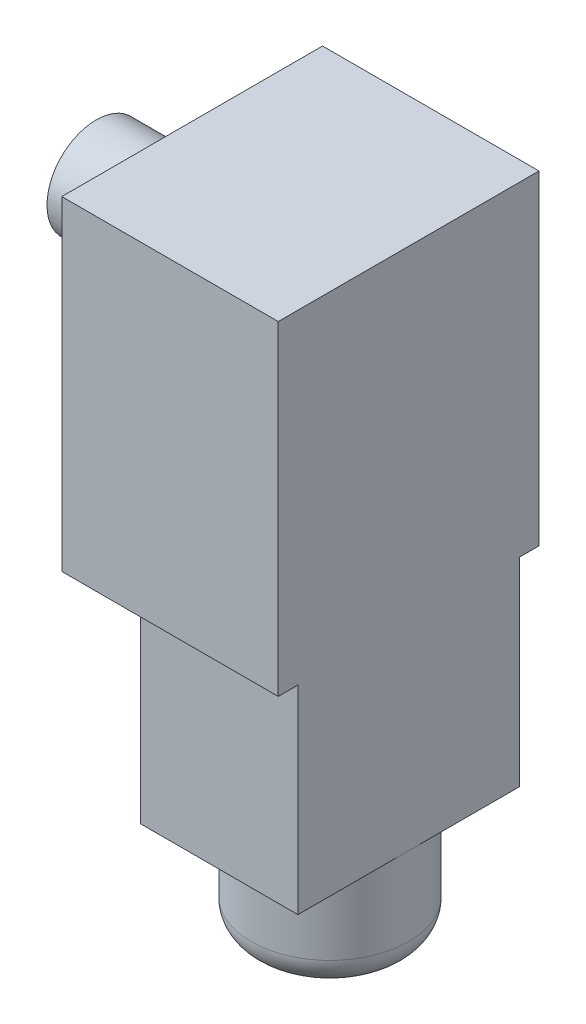
ISO-10303-21;
HEADER;
FILE_DESCRIPTION(('STEP AP214'),'2;1');
FILE_NAME('part.step','',(''),(''),'','','');
FILE_SCHEMA(('AUTOMOTIVE_DESIGN { 1 0 10303 214 1 1 1 1 }'));
ENDSEC;
DATA;
#1=APPLICATION_CONTEXT('core data for automotive mechanical design processes');
#2=APPLICATION_PROTOCOL_DEFINITION('international standard','automotive_design',2000,#1);
#3=PRODUCT_CONTEXT('',#1,'mechanical');
#4=PRODUCT('Part','Part','',(#3));
#5=PRODUCT_RELATED_PRODUCT_CATEGORY('part','',(#4));
#6=PRODUCT_DEFINITION_FORMATION('','',#4);
#7=PRODUCT_DEFINITION_CONTEXT('part definition',#1,'design');
#8=PRODUCT_DEFINITION('design','',#6,#7);
#9=PRODUCT_DEFINITION_SHAPE('','',#8);
#10=(LENGTH_UNIT() NAMED_UNIT(*) SI_UNIT(.MILLI.,.METRE.));
#11=(NAMED_UNIT(*) PLANE_ANGLE_UNIT() SI_UNIT($,.RADIAN.));
#12=(NAMED_UNIT(*) SI_UNIT($,.STERADIAN.) SOLID_ANGLE_UNIT());
#13=UNCERTAINTY_MEASURE_WITH_UNIT(LENGTH_MEASURE(1.E-05),#10,'distance_accuracy_value','');
#14=(GEOMETRIC_REPRESENTATION_CONTEXT(3) GLOBAL_UNCERTAINTY_ASSIGNED_CONTEXT((#13)) GLOBAL_UNIT_ASSIGNED_CONTEXT((#10,
#11,#12)) REPRESENTATION_CONTEXT('',''));
#15=CARTESIAN_POINT('',(0.,0.,0.));
#16=DIRECTION('',(0.,0.,1.));
#17=DIRECTION('',(1.,0.,0.));
#18=AXIS2_PLACEMENT_3D('',#15,#16,#17);
#19=CARTESIAN_POINT('',(-44.8287983151088,0.,0.));
#20=DIRECTION('',(1.,0.,0.));
#21=DIRECTION('',(0.,1.,0.));
#22=AXIS2_PLACEMENT_3D('',#19,#20,#21);
#23=PLANE('',#22);
#24=DIRECTION('',(0.,0.,1.));
#25=VECTOR('',#24,1.);
#26=CARTESIAN_POINT('',(-44.8287983151088,-46.6661460319244,22.5));
#27=LINE('',#26,#25);
#28=CARTESIAN_POINT('',(-44.8287983151088,-46.6661460319244,-2.));
#29=VERTEX_POINT('',#28);
#30=CARTESIAN_POINT('',(-44.8287983151088,-46.6661460319244,24.5));
#31=VERTEX_POINT('',#30);
#32=EDGE_CURVE('E59',#29,#31,#27,.T.);
#33=ORIENTED_EDGE('',*,*,#32,.T.);
#34=DIRECTION('',(0.,-1.,0.));
#35=VECTOR('',#34,1.);
#36=CARTESIAN_POINT('',(-44.8287983151088,-46.6661460319244,24.5));
#37=LINE('',#36,#35);
#38=CARTESIAN_POINT('',(-44.8287983151088,-13.6718417945691,24.5));
#39=VERTEX_POINT('',#38);
#40=EDGE_CURVE('E252',#39,#31,#37,.T.);
#41=ORIENTED_EDGE('',*,*,#40,.F.);
#42=DIRECTION('',(0.,0.,-1.));
#43=VECTOR('',#42,1.);
#44=CARTESIAN_POINT('',(-44.8287983151088,-13.6718417945691,22.5));
#45=LINE('',#44,#43);
#46=CARTESIAN_POINT('',(-44.8287983151088,-13.6718417945691,-2.));
#47=VERTEX_POINT('',#46);
#48=EDGE_CURVE('E83',#39,#47,#45,.T.);
#49=ORIENTED_EDGE('',*,*,#48,.T.);
#50=DIRECTION('',(0.,1.,0.));
#51=VECTOR('',#50,1.);
#52=CARTESIAN_POINT('',(-44.8287983151088,-13.6718417945691,-2.));
#53=LINE('',#52,#51);
#54=EDGE_CURVE('E111',#29,#47,#53,.T.);
#55=ORIENTED_EDGE('',*,*,#54,.F.);
#56=EDGE_LOOP('',(#33,#41,#49,#55));
#57=FACE_BOUND('',#56,.T.);
#58=CARTESIAN_POINT('',(-44.8287983151088,-23.6718417945691,11.));
#59=DIRECTION('',(1.,0.,0.));
#60=DIRECTION('',(0.,1.,0.));
#61=AXIS2_PLACEMENT_3D('',#58,#59,#60);
#62=CIRCLE('',#61,5.);
#63=CARTESIAN_POINT('',(-44.8287983151088,-18.6718417945691,11.));
#64=VERTEX_POINT('',#63);
#65=EDGE_CURVE('E11',#64,#64,#62,.F.);
#66=ORIENTED_EDGE('',*,*,#65,.F.);
#67=EDGE_LOOP('',(#66));
#68=FACE_BOUND('',#67,.T.);
#69=ADVANCED_FACE('F35',(#57,#68),#23,.F.);
#70=CARTESIAN_POINT('',(-42.8287983151088,-77.8718417945691,22.5));
#71=DIRECTION('',(0.,1.,0.));
#72=DIRECTION('',(0.,0.,1.));
#73=AXIS2_PLACEMENT_3D('',#70,#71,#72);
#74=PLANE('',#73);
#75=CARTESIAN_POINT('',(-30.8287983151088,-77.8718417945691,11.25));
#76=DIRECTION('',(0.,1.,0.));
#77=DIRECTION('',(0.,0.,1.));
#78=AXIS2_PLACEMENT_3D('',#75,#76,#77);
#79=CIRCLE('',#78,5.);
#80=CARTESIAN_POINT('',(-30.8287983151088,-77.8718417945691,16.25));
#81=VERTEX_POINT('',#80);
#82=EDGE_CURVE('E137',#81,#81,#79,.F.);
#83=ORIENTED_EDGE('',*,*,#82,.T.);
#84=EDGE_LOOP('',(#83));
#85=FACE_BOUND('',#84,.T.);
#86=ADVANCED_FACE('F151',(#85),#74,.F.);
#87=CARTESIAN_POINT('',(-38.8287983151088,0.,0.));
#88=DIRECTION('',(-1.,0.,0.));
#89=DIRECTION('',(0.,0.,1.));
#90=AXIS2_PLACEMENT_3D('',#87,#88,#89);
#91=PLANE('',#90);
#92=DIRECTION('',(0.,-1.,0.));
#93=VECTOR('',#92,1.);
#94=CARTESIAN_POINT('',(-38.8287983151088,-46.6661460319244,0.));
#95=LINE('',#94,#93);
#96=CARTESIAN_POINT('',(-38.8287983151088,-66.6661460319244,0.));
#97=VERTEX_POINT('',#96);
#98=CARTESIAN_POINT('',(-38.8287983151088,-66.8718417945691,0.));
#99=VERTEX_POINT('',#98);
#100=EDGE_CURVE('E247',#97,#99,#95,.T.);
#101=ORIENTED_EDGE('',*,*,#100,.T.);
#102=DIRECTION('',(0.,0.,-1.));
#103=VECTOR('',#102,1.);
#104=CARTESIAN_POINT('',(-38.8287983151088,-66.8718417945691,0.));
#105=LINE('',#104,#103);
#106=CARTESIAN_POINT('',(-38.8287983151088,-66.8718417945691,11.25));
#107=VERTEX_POINT('',#106);
#108=EDGE_CURVE('E219',#107,#99,#105,.T.);
#109=ORIENTED_EDGE('',*,*,#108,.F.);
#110=DIRECTION('',(0.,0.,-1.));
#111=VECTOR('',#110,1.);
#112=CARTESIAN_POINT('',(-38.8287983151088,-66.8718417945691,0.));
#113=LINE('',#112,#111);
#114=CARTESIAN_POINT('',(-38.8287983151088,-66.8718417945691,22.5));
#115=VERTEX_POINT('',#114);
#116=EDGE_CURVE('E234',#115,#107,#113,.T.);
#117=ORIENTED_EDGE('',*,*,#116,.F.);
#118=DIRECTION('',(0.,1.,0.));
#119=VECTOR('',#118,1.);
#120=CARTESIAN_POINT('',(-38.8287983151088,-46.6661460319244,22.5));
#121=LINE('',#120,#119);
#122=CARTESIAN_POINT('',(-38.8287983151088,-66.6661460319244,22.5));
#123=VERTEX_POINT('',#122);
#124=EDGE_CURVE('E249',#115,#123,#121,.T.);
#125=ORIENTED_EDGE('',*,*,#124,.T.);
#126=DIRECTION('',(0.,0.,1.));
#127=VECTOR('',#126,1.);
#128=CARTESIAN_POINT('',(-38.8287983151088,-66.6661460319244,0.));
#129=LINE('',#128,#127);
#130=EDGE_CURVE('E240',#97,#123,#129,.T.);
#131=ORIENTED_EDGE('',*,*,#130,.F.);
#132=EDGE_LOOP('',(#101,#109,#117,#125,#131));
#133=FACE_BOUND('',#132,.T.);
#134=ADVANCED_FACE('F153',(#133),#91,.T.);
#135=CARTESIAN_POINT('',(0.,0.,0.));
#136=DIRECTION('',(0.,0.,1.));
#137=DIRECTION('',(1.,0.,0.));
#138=AXIS2_PLACEMENT_3D('',#135,#136,#137);
#139=PLANE('',#138);
#140=DIRECTION('',(1.,0.,0.));
#141=VECTOR('',#140,1.);
#142=CARTESIAN_POINT('',(0.,-66.8718417945691,0.));
#143=LINE('',#142,#141);
#144=CARTESIAN_POINT('',(-22.8287983151088,-66.8718417945691,0.));
#145=VERTEX_POINT('',#144);
#146=EDGE_CURVE('E214',#99,#145,#143,.T.);
#147=ORIENTED_EDGE('',*,*,#146,.F.);
#148=ORIENTED_EDGE('',*,*,#100,.F.);
#149=CARTESIAN_POINT('',(-38.8287983151088,-46.6661460319244,0.));
#150=VERTEX_POINT('',#149);
#151=EDGE_CURVE('E50',#150,#97,#95,.T.);
#152=ORIENTED_EDGE('',*,*,#151,.F.);
#153=DIRECTION('',(-1.,0.,0.));
#154=VECTOR('',#153,1.);
#155=CARTESIAN_POINT('',(-44.8287983151088,-46.6661460319244,0.));
#156=LINE('',#155,#154);
#157=CARTESIAN_POINT('',(-22.8287983151088,-46.6661460319244,0.));
#158=VERTEX_POINT('',#157);
#159=EDGE_CURVE('E122',#158,#150,#156,.T.);
#160=ORIENTED_EDGE('',*,*,#159,.F.);
#161=DIRECTION('',(0.,1.,0.));
#162=VECTOR('',#161,1.);
#163=CARTESIAN_POINT('',(-22.8287983151088,-13.6718417945691,0.));
#164=LINE('',#163,#162);
#165=EDGE_CURVE('E73',#145,#158,#164,.T.);
#166=ORIENTED_EDGE('',*,*,#165,.F.);
#167=EDGE_LOOP('',(#147,#148,#152,#160,#166));
#168=FACE_BOUND('',#167,.T.);
#169=ADVANCED_FACE('F158',(#168),#139,.F.);
#170=CARTESIAN_POINT('',(-22.8287983151088,-13.6718417945691,22.5));
#171=DIRECTION('',(-1.,0.,0.));
#172=DIRECTION('',(0.,-1.,0.));
#173=AXIS2_PLACEMENT_3D('',#170,#171,#172);
#174=PLANE('',#173);
#175=DIRECTION('',(0.,0.,1.));
#176=VECTOR('',#175,1.);
#177=CARTESIAN_POINT('',(-22.8287983151088,-66.8718417945691,0.));
#178=LINE('',#177,#176);
#179=CARTESIAN_POINT('',(-22.8287983151088,-66.8718417945691,11.25));
#180=VERTEX_POINT('',#179);
#181=EDGE_CURVE('E211',#145,#180,#178,.T.);
#182=ORIENTED_EDGE('',*,*,#181,.F.);
#183=ORIENTED_EDGE('',*,*,#165,.T.);
#184=DIRECTION('',(0.,0.,1.));
#185=VECTOR('',#184,1.);
#186=CARTESIAN_POINT('',(-22.8287983151088,-46.6661460319244,-2.));
#187=LINE('',#186,#185);
#188=CARTESIAN_POINT('',(-22.8287983151088,-46.6661460319244,-2.));
#189=VERTEX_POINT('',#188);
#190=EDGE_CURVE('E114',#189,#158,#187,.T.);
#191=ORIENTED_EDGE('',*,*,#190,.F.);
#192=DIRECTION('',(0.,-1.,0.));
#193=VECTOR('',#192,1.);
#194=CARTESIAN_POINT('',(-22.8287983151088,-13.6718417945691,-2.));
#195=LINE('',#194,#193);
#196=CARTESIAN_POINT('',(-22.8287983151088,-13.6718417945691,-2.));
#197=VERTEX_POINT('',#196);
#198=EDGE_CURVE('E109',#197,#189,#195,.T.);
#199=ORIENTED_EDGE('',*,*,#198,.F.);
#200=DIRECTION('',(0.,0.,-1.));
#201=VECTOR('',#200,1.);
#202=CARTESIAN_POINT('',(-22.8287983151088,-13.6718417945691,22.5));
#203=LINE('',#202,#201);
#204=CARTESIAN_POINT('',(-22.8287983151088,-13.6718417945691,24.5));
#205=VERTEX_POINT('',#204);
#206=EDGE_CURVE('E95',#205,#197,#203,.T.);
#207=ORIENTED_EDGE('',*,*,#206,.F.);
#208=DIRECTION('',(0.,1.,0.));
#209=VECTOR('',#208,1.);
#210=CARTESIAN_POINT('',(-22.8287983151088,-46.6661460319244,24.5));
#211=LINE('',#210,#209);
#212=CARTESIAN_POINT('',(-22.8287983151088,-46.6661460319244,24.5));
#213=VERTEX_POINT('',#212);
#214=EDGE_CURVE('E258',#213,#205,#211,.T.);
#215=ORIENTED_EDGE('',*,*,#214,.F.);
#216=DIRECTION('',(0.,0.,-1.));
#217=VECTOR('',#216,1.);
#218=CARTESIAN_POINT('',(-22.8287983151088,-46.6661460319244,24.5));
#219=LINE('',#218,#217);
#220=CARTESIAN_POINT('',(-22.8287983151088,-46.6661460319244,22.5));
#221=VERTEX_POINT('',#220);
#222=EDGE_CURVE('E125',#213,#221,#219,.T.);
#223=ORIENTED_EDGE('',*,*,#222,.T.);
#224=DIRECTION('',(0.,1.,0.));
#225=VECTOR('',#224,1.);
#226=CARTESIAN_POINT('',(-22.8287983151088,-13.6718417945691,22.5));
#227=LINE('',#226,#225);
#228=CARTESIAN_POINT('',(-22.8287983151088,-66.8718417945691,22.5));
#229=VERTEX_POINT('',#228);
#230=EDGE_CURVE('E105',#229,#221,#227,.T.);
#231=ORIENTED_EDGE('',*,*,#230,.F.);
#232=DIRECTION('',(0.,0.,1.));
#233=VECTOR('',#232,1.);
#234=CARTESIAN_POINT('',(-22.8287983151088,-66.8718417945691,0.));
#235=LINE('',#234,#233);
#236=EDGE_CURVE('E228',#180,#229,#235,.T.);
#237=ORIENTED_EDGE('',*,*,#236,.F.);
#238=EDGE_LOOP('',(#182,#183,#191,#199,#207,#215,#223,#231,#237));
#239=FACE_BOUND('',#238,.T.);
#240=ADVANCED_FACE('F113',(#239),#174,.F.);
#241=CARTESIAN_POINT('',(0.,0.,22.5));
#242=DIRECTION('',(0.,0.,1.));
#243=DIRECTION('',(1.,0.,0.));
#244=AXIS2_PLACEMENT_3D('',#241,#242,#243);
#245=PLANE('',#244);
#246=ORIENTED_EDGE('',*,*,#124,.F.);
#247=DIRECTION('',(-1.,0.,0.));
#248=VECTOR('',#247,1.);
#249=CARTESIAN_POINT('',(0.,-66.8718417945691,22.5));
#250=LINE('',#249,#248);
#251=EDGE_CURVE('E231',#229,#115,#250,.T.);
#252=ORIENTED_EDGE('',*,*,#251,.F.);
#253=ORIENTED_EDGE('',*,*,#230,.T.);
#254=DIRECTION('',(1.,0.,0.));
#255=VECTOR('',#254,1.);
#256=CARTESIAN_POINT('',(-44.8287983151088,-46.6661460319244,22.5));
#257=LINE('',#256,#255);
#258=CARTESIAN_POINT('',(-38.8287983151088,-46.6661460319244,22.5));
#259=VERTEX_POINT('',#258);
#260=EDGE_CURVE('E104',#259,#221,#257,.T.);
#261=ORIENTED_EDGE('',*,*,#260,.F.);
#262=DIRECTION('',(0.,1.,0.));
#263=VECTOR('',#262,1.);
#264=CARTESIAN_POINT('',(-38.8287983151088,-66.6661460319244,22.5));
#265=LINE('',#264,#263);
#266=EDGE_CURVE('E243',#123,#259,#265,.T.);
#267=ORIENTED_EDGE('',*,*,#266,.F.);
#268=EDGE_LOOP('',(#246,#252,#253,#261,#267));
#269=FACE_BOUND('',#268,.T.);
#270=ADVANCED_FACE('F166',(#269),#245,.T.);
#271=CARTESIAN_POINT('',(-44.8287983151088,-46.6661460319244,22.5));
#272=DIRECTION('',(0.,1.,0.));
#273=DIRECTION('',(-1.,0.,0.));
#274=AXIS2_PLACEMENT_3D('',#271,#272,#273);
#275=PLANE('',#274);
#276=CARTESIAN_POINT('',(-27.5787983151088,-46.6661460319244,11.25));
#277=DIRECTION('',(0.,-1.,0.));
#278=DIRECTION('',(-1.,0.,0.));
#279=AXIS2_PLACEMENT_3D('',#276,#277,#278);
#280=CIRCLE('',#279,15.9099025766973);
#281=EDGE_CURVE('E237',#259,#150,#280,.T.);
#282=ORIENTED_EDGE('',*,*,#281,.F.);
#283=ORIENTED_EDGE('',*,*,#260,.T.);
#284=ORIENTED_EDGE('',*,*,#222,.F.);
#285=DIRECTION('',(1.,0.,0.));
#286=VECTOR('',#285,1.);
#287=CARTESIAN_POINT('',(-44.8287983151088,-46.6661460319244,24.5));
#288=LINE('',#287,#286);
#289=EDGE_CURVE('E255',#31,#213,#288,.T.);
#290=ORIENTED_EDGE('',*,*,#289,.F.);
#291=ORIENTED_EDGE('',*,*,#32,.F.);
#292=DIRECTION('',(-1.,0.,0.));
#293=VECTOR('',#292,1.);
#294=CARTESIAN_POINT('',(-44.8287983151088,-46.6661460319244,-2.));
#295=LINE('',#294,#293);
#296=EDGE_CURVE('E115',#189,#29,#295,.T.);
#297=ORIENTED_EDGE('',*,*,#296,.F.);
#298=ORIENTED_EDGE('',*,*,#190,.T.);
#299=ORIENTED_EDGE('',*,*,#159,.T.);
#300=EDGE_LOOP('',(#282,#283,#284,#290,#291,#297,#298,#299));
#301=FACE_BOUND('',#300,.T.);
#302=ADVANCED_FACE('F169',(#301),#275,.F.);
#303=CARTESIAN_POINT('',(-42.8287983151088,-13.6718417945691,22.5));
#304=DIRECTION('',(0.,-1.,0.));
#305=DIRECTION('',(0.,0.,-1.));
#306=AXIS2_PLACEMENT_3D('',#303,#304,#305);
#307=PLANE('',#306);
#308=ORIENTED_EDGE('',*,*,#206,.T.);
#309=DIRECTION('',(1.,0.,0.));
#310=VECTOR('',#309,1.);
#311=CARTESIAN_POINT('',(-44.8287983151088,-13.6718417945691,-2.));
#312=LINE('',#311,#310);
#313=EDGE_CURVE('E98',#47,#197,#312,.T.);
#314=ORIENTED_EDGE('',*,*,#313,.F.);
#315=ORIENTED_EDGE('',*,*,#48,.F.);
#316=DIRECTION('',(-1.,0.,0.));
#317=VECTOR('',#316,1.);
#318=CARTESIAN_POINT('',(-44.8287983151088,-13.6718417945691,24.5));
#319=LINE('',#318,#317);
#320=EDGE_CURVE('E100',#205,#39,#319,.T.);
#321=ORIENTED_EDGE('',*,*,#320,.F.);
#322=EDGE_LOOP('',(#308,#314,#315,#321));
#323=FACE_BOUND('',#322,.T.);
#324=ADVANCED_FACE('F97',(#323),#307,.F.);
#325=CARTESIAN_POINT('',(0.,0.,-2.));
#326=DIRECTION('',(0.,0.,1.));
#327=DIRECTION('',(1.,0.,0.));
#328=AXIS2_PLACEMENT_3D('',#325,#326,#327);
#329=PLANE('',#328);
#330=ORIENTED_EDGE('',*,*,#54,.T.);
#331=ORIENTED_EDGE('',*,*,#313,.T.);
#332=ORIENTED_EDGE('',*,*,#198,.T.);
#333=ORIENTED_EDGE('',*,*,#296,.T.);
#334=EDGE_LOOP('',(#330,#331,#332,#333));
#335=FACE_BOUND('',#334,.T.);
#336=ADVANCED_FACE('F108',(#335),#329,.F.);
#337=CARTESIAN_POINT('',(0.,0.,24.5));
#338=DIRECTION('',(0.,0.,-1.));
#339=DIRECTION('',(-1.,0.,0.));
#340=AXIS2_PLACEMENT_3D('',#337,#338,#339);
#341=PLANE('',#340);
#342=ORIENTED_EDGE('',*,*,#40,.T.);
#343=ORIENTED_EDGE('',*,*,#289,.T.);
#344=ORIENTED_EDGE('',*,*,#214,.T.);
#345=ORIENTED_EDGE('',*,*,#320,.T.);
#346=EDGE_LOOP('',(#342,#343,#344,#345));
#347=FACE_BOUND('',#346,.T.);
#348=ADVANCED_FACE('F180',(#347),#341,.F.);
#349=CARTESIAN_POINT('',(-27.5787983151088,-66.6661460319244,11.25));
#350=DIRECTION('',(0.,1.,0.));
#351=DIRECTION('',(-1.,0.,0.));
#352=AXIS2_PLACEMENT_3D('',#349,#350,#351);
#353=CYLINDRICAL_SURFACE('',#352,15.9099025766973);
#354=ORIENTED_EDGE('',*,*,#281,.T.);
#355=ORIENTED_EDGE('',*,*,#151,.T.);
#356=CARTESIAN_POINT('',(-27.5787983151088,-66.6661460319244,11.25));
#357=DIRECTION('',(0.,-1.,0.));
#358=DIRECTION('',(-1.,0.,0.));
#359=AXIS2_PLACEMENT_3D('',#356,#357,#358);
#360=CIRCLE('',#359,15.9099025766973);
#361=EDGE_CURVE('E238',#123,#97,#360,.T.);
#362=ORIENTED_EDGE('',*,*,#361,.F.);
#363=ORIENTED_EDGE('',*,*,#266,.T.);
#364=EDGE_LOOP('',(#354,#355,#362,#363));
#365=FACE_BOUND('',#364,.T.);
#366=ADVANCED_FACE('F182',(#365),#353,.T.);
#367=CARTESIAN_POINT('',(-27.5787983151088,-66.6661460319244,11.25));
#368=DIRECTION('',(0.,1.,0.));
#369=DIRECTION('',(-1.,0.,0.));
#370=AXIS2_PLACEMENT_3D('',#367,#368,#369);
#371=PLANE('',#370);
#372=ORIENTED_EDGE('',*,*,#361,.T.);
#373=ORIENTED_EDGE('',*,*,#130,.T.);
#374=EDGE_LOOP('',(#372,#373));
#375=FACE_BOUND('',#374,.T.);
#376=ADVANCED_FACE('F187',(#375),#371,.F.);
#377=CARTESIAN_POINT('',(-30.8287983151088,-66.8718417945691,11.25));
#378=DIRECTION('',(0.,-1.,0.));
#379=DIRECTION('',(0.,0.,-1.));
#380=AXIS2_PLACEMENT_3D('',#377,#378,#379);
#381=CYLINDRICAL_SURFACE('',#380,8.);
#382=CARTESIAN_POINT('',(-30.8287983151088,-74.8718417945691,11.25));
#383=DIRECTION('',(0.,1.,0.));
#384=DIRECTION('',(0.,0.,1.));
#385=AXIS2_PLACEMENT_3D('',#382,#383,#384);
#386=CIRCLE('',#385,8.);
#387=CARTESIAN_POINT('',(-30.8287983151088,-74.8718417945691,19.25));
#388=VERTEX_POINT('',#387);
#389=EDGE_CURVE('E43',#388,#388,#386,.T.);
#390=ORIENTED_EDGE('',*,*,#389,.T.);
#391=EDGE_LOOP('',(#390));
#392=FACE_BOUND('',#391,.T.);
#393=CARTESIAN_POINT('',(-30.8287983151088,-66.8718417945691,11.25));
#394=DIRECTION('',(0.,-1.,0.));
#395=DIRECTION('',(0.,0.,-1.));
#396=AXIS2_PLACEMENT_3D('',#393,#394,#395);
#397=CIRCLE('',#396,8.);
#398=EDGE_CURVE('E222',#107,#180,#397,.T.);
#399=ORIENTED_EDGE('',*,*,#398,.T.);
#400=CARTESIAN_POINT('',(-30.8287983151088,-66.8718417945691,11.25));
#401=DIRECTION('',(0.,-1.,0.));
#402=DIRECTION('',(0.,0.,-1.));
#403=AXIS2_PLACEMENT_3D('',#400,#401,#402);
#404=CIRCLE('',#403,8.);
#405=EDGE_CURVE('E225',#180,#107,#404,.T.);
#406=ORIENTED_EDGE('',*,*,#405,.T.);
#407=EDGE_LOOP('',(#399,#406));
#408=FACE_BOUND('',#407,.T.);
#409=ADVANCED_FACE('F142',(#392,#408),#381,.T.);
#410=CARTESIAN_POINT('',(0.,-66.8718417945691,0.));
#411=DIRECTION('',(0.,-1.,0.));
#412=DIRECTION('',(0.,0.,-1.));
#413=AXIS2_PLACEMENT_3D('',#410,#411,#412);
#414=PLANE('',#413);
#415=ORIENTED_EDGE('',*,*,#405,.F.);
#416=ORIENTED_EDGE('',*,*,#236,.T.);
#417=ORIENTED_EDGE('',*,*,#251,.T.);
#418=ORIENTED_EDGE('',*,*,#116,.T.);
#419=EDGE_LOOP('',(#415,#416,#417,#418));
#420=FACE_BOUND('',#419,.T.);
#421=ADVANCED_FACE('F193',(#420),#414,.T.);
#422=CARTESIAN_POINT('',(0.,-66.8718417945691,0.));
#423=DIRECTION('',(0.,-1.,0.));
#424=DIRECTION('',(0.,0.,-1.));
#425=AXIS2_PLACEMENT_3D('',#422,#423,#424);
#426=PLANE('',#425);
#427=ORIENTED_EDGE('',*,*,#398,.F.);
#428=ORIENTED_EDGE('',*,*,#108,.T.);
#429=ORIENTED_EDGE('',*,*,#146,.T.);
#430=ORIENTED_EDGE('',*,*,#181,.T.);
#431=EDGE_LOOP('',(#427,#428,#429,#430));
#432=FACE_BOUND('',#431,.T.);
#433=ADVANCED_FACE('F148',(#432),#426,.T.);
#434=CARTESIAN_POINT('',(-30.8287983151088,-74.8718417945691,11.25));
#435=DIRECTION('',(0.,1.,0.));
#436=DIRECTION('',(0.,0.,1.));
#437=AXIS2_PLACEMENT_3D('',#434,#435,#436);
#438=TOROIDAL_SURFACE('',#437,5.,3.);
#439=ORIENTED_EDGE('',*,*,#389,.F.);
#440=EDGE_LOOP('',(#439));
#441=FACE_BOUND('',#440,.T.);
#442=ORIENTED_EDGE('',*,*,#82,.F.);
#443=EDGE_LOOP('',(#442));
#444=FACE_BOUND('',#443,.T.);
#445=ADVANCED_FACE('F37',(#441,#444),#438,.T.);
#446=CARTESIAN_POINT('',(-54.8287983151088,-23.6718417945691,11.));
#447=DIRECTION('',(1.,0.,0.));
#448=DIRECTION('',(0.,1.,0.));
#449=AXIS2_PLACEMENT_3D('',#446,#447,#448);
#450=CYLINDRICAL_SURFACE('',#449,5.);
#451=CARTESIAN_POINT('',(-54.8287983151088,-23.6718417945691,11.));
#452=DIRECTION('',(-1.,0.,0.));
#453=DIRECTION('',(0.,-1.,0.));
#454=AXIS2_PLACEMENT_3D('',#451,#452,#453);
#455=CIRCLE('',#454,5.);
#456=CARTESIAN_POINT('',(-54.8287983151088,-28.6718417945691,11.));
#457=VERTEX_POINT('',#456);
#458=EDGE_CURVE('E210',#457,#457,#455,.T.);
#459=ORIENTED_EDGE('',*,*,#458,.F.);
#460=EDGE_LOOP('',(#459));
#461=FACE_BOUND('',#460,.T.);
#462=ORIENTED_EDGE('',*,*,#65,.T.);
#463=EDGE_LOOP('',(#462));
#464=FACE_BOUND('',#463,.T.);
#465=ADVANCED_FACE('F147',(#461,#464),#450,.T.);
#466=CARTESIAN_POINT('',(-54.8287983151088,-23.6718417945691,11.));
#467=DIRECTION('',(-1.,0.,0.));
#468=DIRECTION('',(0.,-1.,0.));
#469=AXIS2_PLACEMENT_3D('',#466,#467,#468);
#470=PLANE('',#469);
#471=ORIENTED_EDGE('',*,*,#458,.T.);
#472=EDGE_LOOP('',(#471));
#473=FACE_BOUND('',#472,.T.);
#474=ADVANCED_FACE('F202',(#473),#470,.T.);
#475=CLOSED_SHELL('',(#69,#86,#134,#169,#240,#270,#302,#324,#336,#348,#366,#376,#409,#421,#433,
#445,#465,#474));
#476=MANIFOLD_SOLID_BREP('B2',#475);
#477=ADVANCED_BREP_SHAPE_REPRESENTATION('',(#18,#476),#14);
#478=SHAPE_DEFINITION_REPRESENTATION(#9,#477);
ENDSEC;
END-ISO-10303-21;
